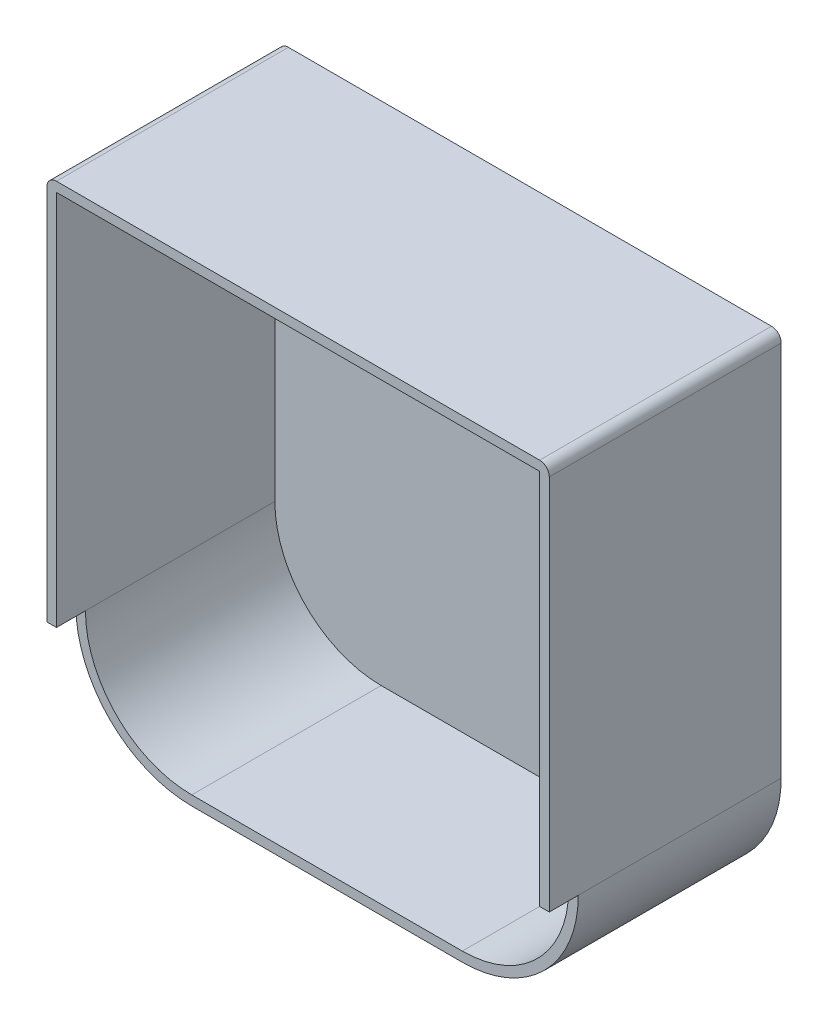
ISO-10303-21;
HEADER;
FILE_DESCRIPTION(('STEP AP214'),'2;1');
FILE_NAME('part.step','',(''),(''),'','','');
FILE_SCHEMA(('AUTOMOTIVE_DESIGN { 1 0 10303 214 1 1 1 1 }'));
ENDSEC;
DATA;
#1=APPLICATION_CONTEXT('core data for automotive mechanical design processes');
#2=APPLICATION_PROTOCOL_DEFINITION('international standard','automotive_design',2000,#1);
#3=PRODUCT_CONTEXT('',#1,'mechanical');
#4=PRODUCT('Part','Part','',(#3));
#5=PRODUCT_RELATED_PRODUCT_CATEGORY('part','',(#4));
#6=PRODUCT_DEFINITION_FORMATION('','',#4);
#7=PRODUCT_DEFINITION_CONTEXT('part definition',#1,'design');
#8=PRODUCT_DEFINITION('design','',#6,#7);
#9=PRODUCT_DEFINITION_SHAPE('','',#8);
#10=(LENGTH_UNIT() NAMED_UNIT(*) SI_UNIT(.MILLI.,.METRE.));
#11=(NAMED_UNIT(*) PLANE_ANGLE_UNIT() SI_UNIT($,.RADIAN.));
#12=(NAMED_UNIT(*) SI_UNIT($,.STERADIAN.) SOLID_ANGLE_UNIT());
#13=UNCERTAINTY_MEASURE_WITH_UNIT(LENGTH_MEASURE(1.E-05),#10,'distance_accuracy_value','');
#14=(GEOMETRIC_REPRESENTATION_CONTEXT(3) GLOBAL_UNCERTAINTY_ASSIGNED_CONTEXT((#13)) GLOBAL_UNIT_ASSIGNED_CONTEXT((#10,
#11,#12)) REPRESENTATION_CONTEXT('',''));
#15=CARTESIAN_POINT('',(0.,0.,0.));
#16=DIRECTION('',(0.,0.,1.));
#17=DIRECTION('',(1.,0.,0.));
#18=AXIS2_PLACEMENT_3D('',#15,#16,#17);
#19=CARTESIAN_POINT('',(0.,0.,120.));
#20=DIRECTION('',(1.,0.,0.));
#21=DIRECTION('',(0.,0.,-1.));
#22=AXIS2_PLACEMENT_3D('',#19,#20,#21);
#23=PLANE('',#22);
#24=DIRECTION('',(0.,-1.,0.));
#25=VECTOR('',#24,1.);
#26=CARTESIAN_POINT('',(0.,0.,120.));
#27=LINE('',#26,#25);
#28=CARTESIAN_POINT('',(0.,255.,120.));
#29=VERTEX_POINT('',#28);
#30=CARTESIAN_POINT('',(0.,60.,120.));
#31=VERTEX_POINT('',#30);
#32=EDGE_CURVE('E523',#29,#31,#27,.T.);
#33=ORIENTED_EDGE('',*,*,#32,.F.);
#34=DIRECTION('',(0.,0.,-1.));
#35=VECTOR('',#34,1.);
#36=CARTESIAN_POINT('',(0.,255.,120.));
#37=LINE('',#36,#35);
#38=CARTESIAN_POINT('',(0.,255.,0.));
#39=VERTEX_POINT('',#38);
#40=EDGE_CURVE('E572',#29,#39,#37,.T.);
#41=ORIENTED_EDGE('',*,*,#40,.T.);
#42=DIRECTION('',(0.,-1.,0.));
#43=VECTOR('',#42,1.);
#44=CARTESIAN_POINT('',(0.,0.,0.));
#45=LINE('',#44,#43);
#46=CARTESIAN_POINT('',(0.,60.,0.));
#47=VERTEX_POINT('',#46);
#48=EDGE_CURVE('E503',#39,#47,#45,.T.);
#49=ORIENTED_EDGE('',*,*,#48,.T.);
#50=DIRECTION('',(0.,0.,-1.));
#51=VECTOR('',#50,1.);
#52=CARTESIAN_POINT('',(0.,60.,120.));
#53=LINE('',#52,#51);
#54=CARTESIAN_POINT('',(0.,60.,105.));
#55=VERTEX_POINT('',#54);
#56=EDGE_CURVE('E568',#47,#55,#53,.F.);
#57=ORIENTED_EDGE('',*,*,#56,.T.);
#58=DIRECTION('',(0.,0.,1.));
#59=VECTOR('',#58,1.);
#60=CARTESIAN_POINT('',(0.,60.,105.));
#61=LINE('',#60,#59);
#62=EDGE_CURVE('E438',#55,#31,#61,.T.);
#63=ORIENTED_EDGE('',*,*,#62,.T.);
#64=EDGE_LOOP('',(#33,#41,#49,#57,#63));
#65=FACE_BOUND('',#64,.T.);
#66=ADVANCED_FACE('F41',(#65),#23,.F.);
#67=CARTESIAN_POINT('',(0.,0.,120.));
#68=DIRECTION('',(0.,1.,0.));
#69=DIRECTION('',(0.,0.,1.));
#70=AXIS2_PLACEMENT_3D('',#67,#68,#69);
#71=PLANE('',#70);
#72=DIRECTION('',(0.,0.,-1.));
#73=VECTOR('',#72,1.);
#74=CARTESIAN_POINT('',(200.,0.,120.));
#75=LINE('',#74,#73);
#76=CARTESIAN_POINT('',(200.,0.,0.));
#77=VERTEX_POINT('',#76);
#78=CARTESIAN_POINT('',(200.,0.,105.));
#79=VERTEX_POINT('',#78);
#80=EDGE_CURVE('E564',#77,#79,#75,.F.);
#81=ORIENTED_EDGE('',*,*,#80,.T.);
#82=DIRECTION('',(1.,0.,0.));
#83=VECTOR('',#82,1.);
#84=CARTESIAN_POINT('',(260.,0.,105.));
#85=LINE('',#84,#83);
#86=CARTESIAN_POINT('',(60.,0.,105.));
#87=VERTEX_POINT('',#86);
#88=EDGE_CURVE('E434',#87,#79,#85,.T.);
#89=ORIENTED_EDGE('',*,*,#88,.F.);
#90=DIRECTION('',(0.,0.,-1.));
#91=VECTOR('',#90,1.);
#92=CARTESIAN_POINT('',(60.,0.,120.));
#93=LINE('',#92,#91);
#94=CARTESIAN_POINT('',(60.,0.,0.));
#95=VERTEX_POINT('',#94);
#96=EDGE_CURVE('E561',#87,#95,#93,.T.);
#97=ORIENTED_EDGE('',*,*,#96,.T.);
#98=DIRECTION('',(1.,0.,0.));
#99=VECTOR('',#98,1.);
#100=CARTESIAN_POINT('',(0.,0.,0.));
#101=LINE('',#100,#99);
#102=EDGE_CURVE('E539',#95,#77,#101,.T.);
#103=ORIENTED_EDGE('',*,*,#102,.T.);
#104=EDGE_LOOP('',(#81,#89,#97,#103));
#105=FACE_BOUND('',#104,.T.);
#106=ADVANCED_FACE('F669',(#105),#71,.F.);
#107=CARTESIAN_POINT('',(260.,0.,120.));
#108=DIRECTION('',(-1.,0.,0.));
#109=DIRECTION('',(0.,0.,1.));
#110=AXIS2_PLACEMENT_3D('',#107,#108,#109);
#111=PLANE('',#110);
#112=DIRECTION('',(0.,1.,0.));
#113=VECTOR('',#112,1.);
#114=CARTESIAN_POINT('',(260.,0.,0.));
#115=LINE('',#114,#113);
#116=CARTESIAN_POINT('',(260.,60.,0.));
#117=VERTEX_POINT('',#116);
#118=CARTESIAN_POINT('',(260.,255.,0.));
#119=VERTEX_POINT('',#118);
#120=EDGE_CURVE('E543',#117,#119,#115,.T.);
#121=ORIENTED_EDGE('',*,*,#120,.T.);
#122=DIRECTION('',(0.,0.,-1.));
#123=VECTOR('',#122,1.);
#124=CARTESIAN_POINT('',(260.,255.,120.));
#125=LINE('',#124,#123);
#126=CARTESIAN_POINT('',(260.,255.,120.));
#127=VERTEX_POINT('',#126);
#128=EDGE_CURVE('E50',#119,#127,#125,.F.);
#129=ORIENTED_EDGE('',*,*,#128,.T.);
#130=DIRECTION('',(0.,1.,0.));
#131=VECTOR('',#130,1.);
#132=CARTESIAN_POINT('',(260.,0.,120.));
#133=LINE('',#132,#131);
#134=CARTESIAN_POINT('',(260.,60.,120.));
#135=VERTEX_POINT('',#134);
#136=EDGE_CURVE('E527',#135,#127,#133,.T.);
#137=ORIENTED_EDGE('',*,*,#136,.F.);
#138=DIRECTION('',(0.,0.,-1.));
#139=VECTOR('',#138,1.);
#140=CARTESIAN_POINT('',(260.,60.,120.));
#141=LINE('',#140,#139);
#142=CARTESIAN_POINT('',(260.,60.,105.));
#143=VERTEX_POINT('',#142);
#144=EDGE_CURVE('E550',#135,#143,#141,.T.);
#145=ORIENTED_EDGE('',*,*,#144,.T.);
#146=EDGE_CURVE('E536',#143,#117,#141,.T.);
#147=ORIENTED_EDGE('',*,*,#146,.T.);
#148=EDGE_LOOP('',(#121,#129,#137,#145,#147));
#149=FACE_BOUND('',#148,.T.);
#150=ADVANCED_FACE('F598',(#149),#111,.F.);
#151=CARTESIAN_POINT('',(0.,260.,120.));
#152=DIRECTION('',(0.,-1.,0.));
#153=DIRECTION('',(0.,0.,-1.));
#154=AXIS2_PLACEMENT_3D('',#151,#152,#153);
#155=PLANE('',#154);
#156=DIRECTION('',(-1.,0.,0.));
#157=VECTOR('',#156,1.);
#158=CARTESIAN_POINT('',(0.,260.,0.));
#159=LINE('',#158,#157);
#160=CARTESIAN_POINT('',(255.,260.,0.));
#161=VERTEX_POINT('',#160);
#162=CARTESIAN_POINT('',(5.,260.,0.));
#163=VERTEX_POINT('',#162);
#164=EDGE_CURVE('E528',#161,#163,#159,.T.);
#165=ORIENTED_EDGE('',*,*,#164,.T.);
#166=DIRECTION('',(0.,0.,-1.));
#167=VECTOR('',#166,1.);
#168=CARTESIAN_POINT('',(5.,260.,120.));
#169=LINE('',#168,#167);
#170=CARTESIAN_POINT('',(5.,260.,120.));
#171=VERTEX_POINT('',#170);
#172=EDGE_CURVE('E586',#163,#171,#169,.F.);
#173=ORIENTED_EDGE('',*,*,#172,.T.);
#174=DIRECTION('',(-1.,0.,0.));
#175=VECTOR('',#174,1.);
#176=CARTESIAN_POINT('',(0.,260.,120.));
#177=LINE('',#176,#175);
#178=CARTESIAN_POINT('',(255.,260.,120.));
#179=VERTEX_POINT('',#178);
#180=EDGE_CURVE('E532',#179,#171,#177,.T.);
#181=ORIENTED_EDGE('',*,*,#180,.F.);
#182=DIRECTION('',(0.,0.,-1.));
#183=VECTOR('',#182,1.);
#184=CARTESIAN_POINT('',(255.,260.,120.));
#185=LINE('',#184,#183);
#186=EDGE_CURVE('E582',#179,#161,#185,.T.);
#187=ORIENTED_EDGE('',*,*,#186,.T.);
#188=EDGE_LOOP('',(#165,#173,#181,#187));
#189=FACE_BOUND('',#188,.T.);
#190=ADVANCED_FACE('F610',(#189),#155,.F.);
#191=CARTESIAN_POINT('',(0.,0.,120.));
#192=DIRECTION('',(0.,0.,-1.));
#193=DIRECTION('',(-1.,0.,0.));
#194=AXIS2_PLACEMENT_3D('',#191,#192,#193);
#195=PLANE('',#194);
#196=ORIENTED_EDGE('',*,*,#32,.T.);
#197=DIRECTION('',(-1.,0.,0.));
#198=VECTOR('',#197,1.);
#199=CARTESIAN_POINT('',(260.,60.,120.));
#200=LINE('',#199,#198);
#201=CARTESIAN_POINT('',(5.00000000000002,60.,120.));
#202=VERTEX_POINT('',#201);
#203=EDGE_CURVE('E396',#202,#31,#200,.T.);
#204=ORIENTED_EDGE('',*,*,#203,.F.);
#205=DIRECTION('',(0.,-1.,0.));
#206=VECTOR('',#205,1.);
#207=CARTESIAN_POINT('',(5.,255.,120.));
#208=LINE('',#207,#206);
#209=CARTESIAN_POINT('',(5.,255.,120.));
#210=VERTEX_POINT('',#209);
#211=EDGE_CURVE('E463',#210,#202,#208,.T.);
#212=ORIENTED_EDGE('',*,*,#211,.F.);
#213=DIRECTION('',(-1.,0.,0.));
#214=VECTOR('',#213,1.);
#215=CARTESIAN_POINT('',(5.,255.,120.));
#216=LINE('',#215,#214);
#217=CARTESIAN_POINT('',(255.,255.,120.));
#218=VERTEX_POINT('',#217);
#219=EDGE_CURVE('E469',#218,#210,#216,.T.);
#220=ORIENTED_EDGE('',*,*,#219,.F.);
#221=DIRECTION('',(0.,1.,0.));
#222=VECTOR('',#221,1.);
#223=CARTESIAN_POINT('',(255.,255.,120.));
#224=LINE('',#223,#222);
#225=CARTESIAN_POINT('',(255.,60.,120.));
#226=VERTEX_POINT('',#225);
#227=EDGE_CURVE('E493',#226,#218,#224,.T.);
#228=ORIENTED_EDGE('',*,*,#227,.F.);
#229=EDGE_CURVE('E439',#135,#226,#200,.T.);
#230=ORIENTED_EDGE('',*,*,#229,.F.);
#231=ORIENTED_EDGE('',*,*,#136,.T.);
#232=CARTESIAN_POINT('',(255.,255.,120.));
#233=DIRECTION('',(0.,0.,-1.));
#234=DIRECTION('',(-1.,0.,0.));
#235=AXIS2_PLACEMENT_3D('',#232,#233,#234);
#236=CIRCLE('',#235,5.);
#237=EDGE_CURVE('E589',#127,#179,#236,.F.);
#238=ORIENTED_EDGE('',*,*,#237,.T.);
#239=ORIENTED_EDGE('',*,*,#180,.T.);
#240=CARTESIAN_POINT('',(5.,255.,120.));
#241=DIRECTION('',(0.,0.,-1.));
#242=DIRECTION('',(-1.,0.,0.));
#243=AXIS2_PLACEMENT_3D('',#240,#241,#242);
#244=CIRCLE('',#243,5.);
#245=EDGE_CURVE('E592',#171,#29,#244,.F.);
#246=ORIENTED_EDGE('',*,*,#245,.T.);
#247=EDGE_LOOP('',(#196,#204,#212,#220,#228,#230,#231,#238,#239,#246));
#248=FACE_BOUND('',#247,.T.);
#249=ADVANCED_FACE('F604',(#248),#195,.F.);
#250=CARTESIAN_POINT('',(0.,0.,0.));
#251=DIRECTION('',(0.,0.,-1.));
#252=DIRECTION('',(-1.,0.,0.));
#253=AXIS2_PLACEMENT_3D('',#250,#251,#252);
#254=PLANE('',#253);
#255=DIRECTION('',(-1.,0.,0.));
#256=VECTOR('',#255,1.);
#257=CARTESIAN_POINT('',(215.,120.,0.));
#258=LINE('',#257,#256);
#259=CARTESIAN_POINT('',(240.,120.,0.));
#260=VERTEX_POINT('',#259);
#261=CARTESIAN_POINT('',(215.,120.,0.));
#262=VERTEX_POINT('',#261);
#263=EDGE_CURVE('E297',#260,#262,#258,.T.);
#264=ORIENTED_EDGE('',*,*,#263,.F.);
#265=DIRECTION('',(0.,-1.,0.));
#266=VECTOR('',#265,1.);
#267=CARTESIAN_POINT('',(240.,120.,0.));
#268=LINE('',#267,#266);
#269=CARTESIAN_POINT('',(240.,230.,0.));
#270=VERTEX_POINT('',#269);
#271=EDGE_CURVE('E303',#270,#260,#268,.T.);
#272=ORIENTED_EDGE('',*,*,#271,.F.);
#273=CARTESIAN_POINT('',(230.,230.,0.));
#274=DIRECTION('',(0.,0.,-1.));
#275=DIRECTION('',(1.,0.,0.));
#276=AXIS2_PLACEMENT_3D('',#273,#274,#275);
#277=CIRCLE('',#276,10.);
#278=CARTESIAN_POINT('',(230.,240.,0.));
#279=VERTEX_POINT('',#278);
#280=EDGE_CURVE('E386',#279,#270,#277,.T.);
#281=ORIENTED_EDGE('',*,*,#280,.F.);
#282=DIRECTION('',(1.,0.,0.));
#283=VECTOR('',#282,1.);
#284=CARTESIAN_POINT('',(230.,240.,0.));
#285=LINE('',#284,#283);
#286=CARTESIAN_POINT('',(30.0000000000001,240.,0.));
#287=VERTEX_POINT('',#286);
#288=EDGE_CURVE('E382',#287,#279,#285,.T.);
#289=ORIENTED_EDGE('',*,*,#288,.F.);
#290=CARTESIAN_POINT('',(30.,230.,0.));
#291=DIRECTION('',(0.,0.,-1.));
#292=DIRECTION('',(1.,0.,0.));
#293=AXIS2_PLACEMENT_3D('',#290,#291,#292);
#294=CIRCLE('',#293,10.);
#295=CARTESIAN_POINT('',(20.,230.,0.));
#296=VERTEX_POINT('',#295);
#297=EDGE_CURVE('E378',#296,#287,#294,.T.);
#298=ORIENTED_EDGE('',*,*,#297,.F.);
#299=DIRECTION('',(0.,1.,0.));
#300=VECTOR('',#299,1.);
#301=CARTESIAN_POINT('',(20.,230.,0.));
#302=LINE('',#301,#300);
#303=CARTESIAN_POINT('',(20.,120.,0.));
#304=VERTEX_POINT('',#303);
#305=EDGE_CURVE('E374',#304,#296,#302,.T.);
#306=ORIENTED_EDGE('',*,*,#305,.F.);
#307=DIRECTION('',(-1.,0.,0.));
#308=VECTOR('',#307,1.);
#309=CARTESIAN_POINT('',(20.,120.,0.));
#310=LINE('',#309,#308);
#311=CARTESIAN_POINT('',(45.,120.,0.));
#312=VERTEX_POINT('',#311);
#313=EDGE_CURVE('E370',#312,#304,#310,.T.);
#314=ORIENTED_EDGE('',*,*,#313,.F.);
#315=DIRECTION('',(0.,-1.,0.));
#316=VECTOR('',#315,1.);
#317=CARTESIAN_POINT('',(45.,120.,0.));
#318=LINE('',#317,#316);
#319=CARTESIAN_POINT('',(45.,205.,0.));
#320=VERTEX_POINT('',#319);
#321=EDGE_CURVE('E366',#320,#312,#318,.T.);
#322=ORIENTED_EDGE('',*,*,#321,.F.);
#323=CARTESIAN_POINT('',(55.,205.,0.));
#324=DIRECTION('',(0.,0.,1.));
#325=DIRECTION('',(-1.,0.,0.));
#326=AXIS2_PLACEMENT_3D('',#323,#324,#325);
#327=CIRCLE('',#326,10.);
#328=CARTESIAN_POINT('',(55.,215.,0.));
#329=VERTEX_POINT('',#328);
#330=EDGE_CURVE('E362',#329,#320,#327,.T.);
#331=ORIENTED_EDGE('',*,*,#330,.F.);
#332=DIRECTION('',(-1.,0.,0.));
#333=VECTOR('',#332,1.);
#334=CARTESIAN_POINT('',(55.,215.,0.));
#335=LINE('',#334,#333);
#336=CARTESIAN_POINT('',(205.,215.,0.));
#337=VERTEX_POINT('',#336);
#338=EDGE_CURVE('E358',#337,#329,#335,.T.);
#339=ORIENTED_EDGE('',*,*,#338,.F.);
#340=CARTESIAN_POINT('',(205.,205.,0.));
#341=DIRECTION('',(0.,0.,1.));
#342=DIRECTION('',(-1.,0.,0.));
#343=AXIS2_PLACEMENT_3D('',#340,#341,#342);
#344=CIRCLE('',#343,10.);
#345=CARTESIAN_POINT('',(215.,205.,0.));
#346=VERTEX_POINT('',#345);
#347=EDGE_CURVE('E354',#346,#337,#344,.T.);
#348=ORIENTED_EDGE('',*,*,#347,.F.);
#349=DIRECTION('',(0.,1.,0.));
#350=VECTOR('',#349,1.);
#351=CARTESIAN_POINT('',(215.,205.,0.));
#352=LINE('',#351,#350);
#353=EDGE_CURVE('E350',#262,#346,#352,.T.);
#354=ORIENTED_EDGE('',*,*,#353,.F.);
#355=EDGE_LOOP('',(#264,#272,#281,#289,#298,#306,#314,#322,#331,#339,#348,#354));
#356=FACE_BOUND('',#355,.T.);
#357=ORIENTED_EDGE('',*,*,#48,.F.);
#358=CARTESIAN_POINT('',(5.,255.,0.));
#359=DIRECTION('',(0.,0.,-1.));
#360=DIRECTION('',(-1.,0.,0.));
#361=AXIS2_PLACEMENT_3D('',#358,#359,#360);
#362=CIRCLE('',#361,5.);
#363=EDGE_CURVE('E579',#39,#163,#362,.T.);
#364=ORIENTED_EDGE('',*,*,#363,.T.);
#365=ORIENTED_EDGE('',*,*,#164,.F.);
#366=CARTESIAN_POINT('',(255.,255.,0.));
#367=DIRECTION('',(0.,0.,-1.));
#368=DIRECTION('',(-1.,0.,0.));
#369=AXIS2_PLACEMENT_3D('',#366,#367,#368);
#370=CIRCLE('',#369,5.);
#371=EDGE_CURVE('E576',#161,#119,#370,.T.);
#372=ORIENTED_EDGE('',*,*,#371,.T.);
#373=ORIENTED_EDGE('',*,*,#120,.F.);
#374=CARTESIAN_POINT('',(200.,60.,0.));
#375=DIRECTION('',(0.,0.,-1.));
#376=DIRECTION('',(-1.,0.,0.));
#377=AXIS2_PLACEMENT_3D('',#374,#375,#376);
#378=CIRCLE('',#377,60.);
#379=EDGE_CURVE('E558',#117,#77,#378,.T.);
#380=ORIENTED_EDGE('',*,*,#379,.T.);
#381=ORIENTED_EDGE('',*,*,#102,.F.);
#382=CARTESIAN_POINT('',(60.,60.,0.));
#383=DIRECTION('',(0.,0.,-1.));
#384=DIRECTION('',(-1.,0.,0.));
#385=AXIS2_PLACEMENT_3D('',#382,#383,#384);
#386=CIRCLE('',#385,60.);
#387=EDGE_CURVE('E554',#95,#47,#386,.T.);
#388=ORIENTED_EDGE('',*,*,#387,.T.);
#389=EDGE_LOOP('',(#357,#364,#365,#372,#373,#380,#381,#388));
#390=FACE_BOUND('',#389,.T.);
#391=ADVANCED_FACE('F614',(#356,#390),#254,.T.);
#392=CARTESIAN_POINT('',(200.,60.,120.));
#393=DIRECTION('',(0.,0.,-1.));
#394=DIRECTION('',(-1.,0.,0.));
#395=AXIS2_PLACEMENT_3D('',#392,#393,#394);
#396=CYLINDRICAL_SURFACE('',#395,60.);
#397=CARTESIAN_POINT('',(200.,60.,105.));
#398=DIRECTION('',(0.,0.,-1.));
#399=DIRECTION('',(-1.,0.,0.));
#400=AXIS2_PLACEMENT_3D('',#397,#398,#399);
#401=CIRCLE('',#400,60.);
#402=EDGE_CURVE('E456',#79,#143,#401,.F.);
#403=ORIENTED_EDGE('',*,*,#402,.F.);
#404=ORIENTED_EDGE('',*,*,#80,.F.);
#405=ORIENTED_EDGE('',*,*,#379,.F.);
#406=ORIENTED_EDGE('',*,*,#146,.F.);
#407=EDGE_LOOP('',(#403,#404,#405,#406));
#408=FACE_BOUND('',#407,.T.);
#409=ADVANCED_FACE('F678',(#408),#396,.T.);
#410=CARTESIAN_POINT('',(60.,60.,120.));
#411=DIRECTION('',(0.,0.,-1.));
#412=DIRECTION('',(-1.,0.,0.));
#413=AXIS2_PLACEMENT_3D('',#410,#411,#412);
#414=CYLINDRICAL_SURFACE('',#413,60.);
#415=CARTESIAN_POINT('',(60.,60.,105.));
#416=DIRECTION('',(0.,0.,-1.));
#417=DIRECTION('',(-1.,0.,0.));
#418=AXIS2_PLACEMENT_3D('',#415,#416,#417);
#419=CIRCLE('',#418,60.);
#420=EDGE_CURVE('E453',#55,#87,#419,.F.);
#421=ORIENTED_EDGE('',*,*,#420,.F.);
#422=ORIENTED_EDGE('',*,*,#56,.F.);
#423=ORIENTED_EDGE('',*,*,#387,.F.);
#424=ORIENTED_EDGE('',*,*,#96,.F.);
#425=EDGE_LOOP('',(#421,#422,#423,#424));
#426=FACE_BOUND('',#425,.T.);
#427=ADVANCED_FACE('F681',(#426),#414,.T.);
#428=CARTESIAN_POINT('',(5.,255.,120.));
#429=DIRECTION('',(0.,0.,-1.));
#430=DIRECTION('',(-1.,0.,0.));
#431=AXIS2_PLACEMENT_3D('',#428,#429,#430);
#432=CYLINDRICAL_SURFACE('',#431,5.);
#433=ORIENTED_EDGE('',*,*,#245,.F.);
#434=ORIENTED_EDGE('',*,*,#172,.F.);
#435=ORIENTED_EDGE('',*,*,#363,.F.);
#436=ORIENTED_EDGE('',*,*,#40,.F.);
#437=EDGE_LOOP('',(#433,#434,#435,#436));
#438=FACE_BOUND('',#437,.T.);
#439=ADVANCED_FACE('F618',(#438),#432,.T.);
#440=CARTESIAN_POINT('',(255.,255.,120.));
#441=DIRECTION('',(0.,0.,-1.));
#442=DIRECTION('',(-1.,0.,0.));
#443=AXIS2_PLACEMENT_3D('',#440,#441,#442);
#444=CYLINDRICAL_SURFACE('',#443,5.);
#445=ORIENTED_EDGE('',*,*,#237,.F.);
#446=ORIENTED_EDGE('',*,*,#128,.F.);
#447=ORIENTED_EDGE('',*,*,#371,.F.);
#448=ORIENTED_EDGE('',*,*,#186,.F.);
#449=EDGE_LOOP('',(#445,#446,#447,#448));
#450=FACE_BOUND('',#449,.T.);
#451=ADVANCED_FACE('F43',(#450),#444,.T.);
#452=CARTESIAN_POINT('',(5.,255.,6.99999999999999));
#453=DIRECTION('',(-1.,0.,0.));
#454=DIRECTION('',(0.,-1.,0.));
#455=AXIS2_PLACEMENT_3D('',#452,#453,#454);
#456=PLANE('',#455);
#457=ORIENTED_EDGE('',*,*,#211,.T.);
#458=DIRECTION('',(0.,0.,1.));
#459=VECTOR('',#458,1.);
#460=CARTESIAN_POINT('',(5.00000000000002,60.,6.99999999999999));
#461=LINE('',#460,#459);
#462=CARTESIAN_POINT('',(5.00000000000002,60.,105.));
#463=VERTEX_POINT('',#462);
#464=EDGE_CURVE('E489',#463,#202,#461,.T.);
#465=ORIENTED_EDGE('',*,*,#464,.F.);
#466=CARTESIAN_POINT('',(5.00000000000002,60.,6.99999999999999));
#467=VERTEX_POINT('',#466);
#468=EDGE_CURVE('E519',#467,#463,#461,.T.);
#469=ORIENTED_EDGE('',*,*,#468,.F.);
#470=DIRECTION('',(0.,-1.,0.));
#471=VECTOR('',#470,1.);
#472=CARTESIAN_POINT('',(5.,255.,6.99999999999999));
#473=LINE('',#472,#471);
#474=CARTESIAN_POINT('',(5.,255.,6.99999999999999));
#475=VERTEX_POINT('',#474);
#476=EDGE_CURVE('E464',#475,#467,#473,.T.);
#477=ORIENTED_EDGE('',*,*,#476,.F.);
#478=DIRECTION('',(0.,0.,1.));
#479=VECTOR('',#478,1.);
#480=CARTESIAN_POINT('',(5.,255.,6.99999999999999));
#481=LINE('',#480,#479);
#482=EDGE_CURVE('E500',#475,#210,#481,.T.);
#483=ORIENTED_EDGE('',*,*,#482,.T.);
#484=EDGE_LOOP('',(#457,#465,#469,#477,#483));
#485=FACE_BOUND('',#484,.T.);
#486=ADVANCED_FACE('F629',(#485),#456,.F.);
#487=CARTESIAN_POINT('',(5.,255.,6.99999999999999));
#488=DIRECTION('',(0.,1.,0.));
#489=DIRECTION('',(0.,0.,1.));
#490=AXIS2_PLACEMENT_3D('',#487,#488,#489);
#491=PLANE('',#490);
#492=ORIENTED_EDGE('',*,*,#219,.T.);
#493=ORIENTED_EDGE('',*,*,#482,.F.);
#494=DIRECTION('',(-1.,0.,0.));
#495=VECTOR('',#494,1.);
#496=CARTESIAN_POINT('',(5.,255.,6.99999999999999));
#497=LINE('',#496,#495);
#498=CARTESIAN_POINT('',(255.,255.,6.99999999999999));
#499=VERTEX_POINT('',#498);
#500=EDGE_CURVE('E485',#499,#475,#497,.T.);
#501=ORIENTED_EDGE('',*,*,#500,.F.);
#502=DIRECTION('',(0.,0.,1.));
#503=VECTOR('',#502,1.);
#504=CARTESIAN_POINT('',(255.,255.,6.99999999999999));
#505=LINE('',#504,#503);
#506=EDGE_CURVE('E504',#499,#218,#505,.T.);
#507=ORIENTED_EDGE('',*,*,#506,.T.);
#508=EDGE_LOOP('',(#492,#493,#501,#507));
#509=FACE_BOUND('',#508,.T.);
#510=ADVANCED_FACE('F633',(#509),#491,.F.);
#511=CARTESIAN_POINT('',(255.,255.,6.99999999999999));
#512=DIRECTION('',(1.,0.,0.));
#513=DIRECTION('',(0.,0.,-1.));
#514=AXIS2_PLACEMENT_3D('',#511,#512,#513);
#515=PLANE('',#514);
#516=ORIENTED_EDGE('',*,*,#227,.T.);
#517=ORIENTED_EDGE('',*,*,#506,.F.);
#518=DIRECTION('',(0.,1.,0.));
#519=VECTOR('',#518,1.);
#520=CARTESIAN_POINT('',(255.,255.,6.99999999999999));
#521=LINE('',#520,#519);
#522=CARTESIAN_POINT('',(255.,60.,6.99999999999999));
#523=VERTEX_POINT('',#522);
#524=EDGE_CURVE('E481',#523,#499,#521,.T.);
#525=ORIENTED_EDGE('',*,*,#524,.F.);
#526=DIRECTION('',(0.,0.,1.));
#527=VECTOR('',#526,1.);
#528=CARTESIAN_POINT('',(255.,60.,6.99999999999999));
#529=LINE('',#528,#527);
#530=CARTESIAN_POINT('',(255.,60.,105.));
#531=VERTEX_POINT('',#530);
#532=EDGE_CURVE('E507',#523,#531,#529,.T.);
#533=ORIENTED_EDGE('',*,*,#532,.T.);
#534=DIRECTION('',(0.,0.,1.));
#535=VECTOR('',#534,1.);
#536=CARTESIAN_POINT('',(255.,60.,6.99999999999999));
#537=LINE('',#536,#535);
#538=EDGE_CURVE('E459',#531,#226,#537,.T.);
#539=ORIENTED_EDGE('',*,*,#538,.T.);
#540=EDGE_LOOP('',(#516,#517,#525,#533,#539));
#541=FACE_BOUND('',#540,.T.);
#542=ADVANCED_FACE('F635',(#541),#515,.F.);
#543=CARTESIAN_POINT('',(200.,60.,6.99999999999999));
#544=DIRECTION('',(0.,0.,1.));
#545=DIRECTION('',(1.,0.,0.));
#546=AXIS2_PLACEMENT_3D('',#543,#544,#545);
#547=CYLINDRICAL_SURFACE('',#546,55.);
#548=DIRECTION('',(0.,0.,1.));
#549=VECTOR('',#548,1.);
#550=CARTESIAN_POINT('',(200.,5.00000000000002,6.99999999999999));
#551=LINE('',#550,#549);
#552=CARTESIAN_POINT('',(200.,5.00000000000002,6.99999999999999));
#553=VERTEX_POINT('',#552);
#554=CARTESIAN_POINT('',(200.,5.,105.));
#555=VERTEX_POINT('',#554);
#556=EDGE_CURVE('E511',#553,#555,#551,.T.);
#557=ORIENTED_EDGE('',*,*,#556,.T.);
#558=CARTESIAN_POINT('',(200.,60.,105.));
#559=DIRECTION('',(0.,0.,-1.));
#560=DIRECTION('',(-1.,0.,0.));
#561=AXIS2_PLACEMENT_3D('',#558,#559,#560);
#562=CIRCLE('',#561,55.);
#563=EDGE_CURVE('E449',#555,#531,#562,.F.);
#564=ORIENTED_EDGE('',*,*,#563,.T.);
#565=ORIENTED_EDGE('',*,*,#532,.F.);
#566=CARTESIAN_POINT('',(200.,60.,6.99999999999999));
#567=DIRECTION('',(0.,0.,1.));
#568=DIRECTION('',(1.,0.,0.));
#569=AXIS2_PLACEMENT_3D('',#566,#567,#568);
#570=CIRCLE('',#569,55.);
#571=EDGE_CURVE('E477',#553,#523,#570,.T.);
#572=ORIENTED_EDGE('',*,*,#571,.F.);
#573=EDGE_LOOP('',(#557,#564,#565,#572));
#574=FACE_BOUND('',#573,.T.);
#575=ADVANCED_FACE('F645',(#574),#547,.F.);
#576=CARTESIAN_POINT('',(60.,5.,6.99999999999999));
#577=DIRECTION('',(0.,-1.,0.));
#578=DIRECTION('',(1.,0.,0.));
#579=AXIS2_PLACEMENT_3D('',#576,#577,#578);
#580=PLANE('',#579);
#581=DIRECTION('',(0.,0.,1.));
#582=VECTOR('',#581,1.);
#583=CARTESIAN_POINT('',(60.,5.,6.99999999999999));
#584=LINE('',#583,#582);
#585=CARTESIAN_POINT('',(60.,5.,6.99999999999999));
#586=VERTEX_POINT('',#585);
#587=CARTESIAN_POINT('',(60.,5.,105.));
#588=VERTEX_POINT('',#587);
#589=EDGE_CURVE('E515',#586,#588,#584,.T.);
#590=ORIENTED_EDGE('',*,*,#589,.T.);
#591=DIRECTION('',(1.,0.,0.));
#592=VECTOR('',#591,1.);
#593=CARTESIAN_POINT('',(60.,5.,105.));
#594=LINE('',#593,#592);
#595=EDGE_CURVE('E445',#588,#555,#594,.T.);
#596=ORIENTED_EDGE('',*,*,#595,.T.);
#597=ORIENTED_EDGE('',*,*,#556,.F.);
#598=DIRECTION('',(1.,0.,0.));
#599=VECTOR('',#598,1.);
#600=CARTESIAN_POINT('',(60.,5.,6.99999999999999));
#601=LINE('',#600,#599);
#602=EDGE_CURVE('E473',#586,#553,#601,.T.);
#603=ORIENTED_EDGE('',*,*,#602,.F.);
#604=EDGE_LOOP('',(#590,#596,#597,#603));
#605=FACE_BOUND('',#604,.T.);
#606=ADVANCED_FACE('F649',(#605),#580,.F.);
#607=CARTESIAN_POINT('',(60.,60.,6.99999999999999));
#608=DIRECTION('',(0.,0.,1.));
#609=DIRECTION('',(1.,0.,0.));
#610=AXIS2_PLACEMENT_3D('',#607,#608,#609);
#611=CYLINDRICAL_SURFACE('',#610,55.);
#612=ORIENTED_EDGE('',*,*,#468,.T.);
#613=CARTESIAN_POINT('',(60.,60.,105.));
#614=DIRECTION('',(0.,0.,-1.));
#615=DIRECTION('',(-1.,0.,0.));
#616=AXIS2_PLACEMENT_3D('',#613,#614,#615);
#617=CIRCLE('',#616,55.);
#618=EDGE_CURVE('E11',#463,#588,#617,.F.);
#619=ORIENTED_EDGE('',*,*,#618,.T.);
#620=ORIENTED_EDGE('',*,*,#589,.F.);
#621=CARTESIAN_POINT('',(60.,60.,6.99999999999999));
#622=DIRECTION('',(0.,0.,1.));
#623=DIRECTION('',(1.,0.,0.));
#624=AXIS2_PLACEMENT_3D('',#621,#622,#623);
#625=CIRCLE('',#624,55.);
#626=EDGE_CURVE('E468',#467,#586,#625,.T.);
#627=ORIENTED_EDGE('',*,*,#626,.F.);
#628=EDGE_LOOP('',(#612,#619,#620,#627));
#629=FACE_BOUND('',#628,.T.);
#630=ADVANCED_FACE('F652',(#629),#611,.F.);
#631=CARTESIAN_POINT('',(60.,60.,6.99999999999999));
#632=DIRECTION('',(0.,0.,1.));
#633=DIRECTION('',(1.,0.,0.));
#634=AXIS2_PLACEMENT_3D('',#631,#632,#633);
#635=PLANE('',#634);
#636=CARTESIAN_POINT('',(39.5,227.5,6.99999999999999));
#637=DIRECTION('',(0.,0.,1.));
#638=DIRECTION('',(1.,0.,0.));
#639=AXIS2_PLACEMENT_3D('',#636,#637,#638);
#640=CIRCLE('',#639,11.);
#641=CARTESIAN_POINT('',(39.5,238.5,6.99999999999999));
#642=VERTEX_POINT('',#641);
#643=CARTESIAN_POINT('',(39.5,216.5,6.99999999999999));
#644=VERTEX_POINT('',#643);
#645=EDGE_CURVE('E294',#642,#644,#640,.T.);
#646=ORIENTED_EDGE('',*,*,#645,.F.);
#647=DIRECTION('',(-1.,0.,0.));
#648=VECTOR('',#647,1.);
#649=CARTESIAN_POINT('',(60.,238.5,6.99999999999999));
#650=LINE('',#649,#648);
#651=CARTESIAN_POINT('',(59.5,238.5,6.99999999999999));
#652=VERTEX_POINT('',#651);
#653=EDGE_CURVE('E282',#652,#642,#650,.T.);
#654=ORIENTED_EDGE('',*,*,#653,.F.);
#655=CARTESIAN_POINT('',(59.5,227.5,6.99999999999999));
#656=DIRECTION('',(0.,0.,1.));
#657=DIRECTION('',(1.,0.,0.));
#658=AXIS2_PLACEMENT_3D('',#655,#656,#657);
#659=CIRCLE('',#658,11.);
#660=CARTESIAN_POINT('',(59.5,216.5,6.99999999999999));
#661=VERTEX_POINT('',#660);
#662=EDGE_CURVE('E257',#661,#652,#659,.T.);
#663=ORIENTED_EDGE('',*,*,#662,.F.);
#664=DIRECTION('',(1.,0.,0.));
#665=VECTOR('',#664,1.);
#666=CARTESIAN_POINT('',(59.9999999999998,216.5,6.99999999999999));
#667=LINE('',#666,#665);
#668=EDGE_CURVE('E291',#644,#661,#667,.T.);
#669=ORIENTED_EDGE('',*,*,#668,.F.);
#670=EDGE_LOOP('',(#646,#654,#663,#669));
#671=FACE_BOUND('',#670,.T.);
#672=ORIENTED_EDGE('',*,*,#476,.T.);
#673=ORIENTED_EDGE('',*,*,#626,.T.);
#674=ORIENTED_EDGE('',*,*,#602,.T.);
#675=ORIENTED_EDGE('',*,*,#571,.T.);
#676=ORIENTED_EDGE('',*,*,#524,.T.);
#677=ORIENTED_EDGE('',*,*,#500,.T.);
#678=EDGE_LOOP('',(#672,#673,#674,#675,#676,#677));
#679=FACE_BOUND('',#678,.T.);
#680=ADVANCED_FACE('F655',(#671,#679),#635,.T.);
#681=CARTESIAN_POINT('',(260.,60.,105.));
#682=DIRECTION('',(0.,1.,0.));
#683=DIRECTION('',(0.,0.,1.));
#684=AXIS2_PLACEMENT_3D('',#681,#682,#683);
#685=PLANE('',#684);
#686=DIRECTION('',(-1.,0.,0.));
#687=VECTOR('',#686,1.);
#688=CARTESIAN_POINT('',(260.,60.,105.));
#689=LINE('',#688,#687);
#690=EDGE_CURVE('E430',#143,#531,#689,.T.);
#691=ORIENTED_EDGE('',*,*,#690,.F.);
#692=ORIENTED_EDGE('',*,*,#144,.F.);
#693=ORIENTED_EDGE('',*,*,#229,.T.);
#694=ORIENTED_EDGE('',*,*,#538,.F.);
#695=EDGE_LOOP('',(#691,#692,#693,#694));
#696=FACE_BOUND('',#695,.T.);
#697=ADVANCED_FACE('F639',(#696),#685,.F.);
#698=ORIENTED_EDGE('',*,*,#203,.T.);
#699=ORIENTED_EDGE('',*,*,#62,.F.);
#700=EDGE_CURVE('E435',#463,#55,#689,.T.);
#701=ORIENTED_EDGE('',*,*,#700,.F.);
#702=ORIENTED_EDGE('',*,*,#464,.T.);
#703=EDGE_LOOP('',(#698,#699,#701,#702));
#704=FACE_BOUND('',#703,.T.);
#705=ADVANCED_FACE('F663',(#704),#685,.F.);
#706=CARTESIAN_POINT('',(0.,0.,105.));
#707=DIRECTION('',(0.,0.,-1.));
#708=DIRECTION('',(-1.,0.,0.));
#709=AXIS2_PLACEMENT_3D('',#706,#707,#708);
#710=PLANE('',#709);
#711=ORIENTED_EDGE('',*,*,#402,.T.);
#712=ORIENTED_EDGE('',*,*,#690,.T.);
#713=ORIENTED_EDGE('',*,*,#563,.F.);
#714=ORIENTED_EDGE('',*,*,#595,.F.);
#715=ORIENTED_EDGE('',*,*,#618,.F.);
#716=ORIENTED_EDGE('',*,*,#700,.T.);
#717=ORIENTED_EDGE('',*,*,#420,.T.);
#718=ORIENTED_EDGE('',*,*,#88,.T.);
#719=EDGE_LOOP('',(#711,#712,#713,#714,#715,#716,#717,#718));
#720=FACE_BOUND('',#719,.T.);
#721=ADVANCED_FACE('F642',(#720),#710,.F.);
#722=CARTESIAN_POINT('',(215.,120.,4.));
#723=DIRECTION('',(0.,-1.,0.));
#724=DIRECTION('',(0.,0.,-1.));
#725=AXIS2_PLACEMENT_3D('',#722,#723,#724);
#726=PLANE('',#725);
#727=ORIENTED_EDGE('',*,*,#263,.T.);
#728=DIRECTION('',(0.,0.,-1.));
#729=VECTOR('',#728,1.);
#730=CARTESIAN_POINT('',(215.,120.,4.));
#731=LINE('',#730,#729);
#732=CARTESIAN_POINT('',(215.,120.,4.));
#733=VERTEX_POINT('',#732);
#734=EDGE_CURVE('E347',#733,#262,#731,.T.);
#735=ORIENTED_EDGE('',*,*,#734,.F.);
#736=DIRECTION('',(-1.,0.,0.));
#737=VECTOR('',#736,1.);
#738=CARTESIAN_POINT('',(215.,120.,4.));
#739=LINE('',#738,#737);
#740=CARTESIAN_POINT('',(240.,120.,4.));
#741=VERTEX_POINT('',#740);
#742=EDGE_CURVE('E298',#741,#733,#739,.T.);
#743=ORIENTED_EDGE('',*,*,#742,.F.);
#744=DIRECTION('',(0.,0.,-1.));
#745=VECTOR('',#744,1.);
#746=CARTESIAN_POINT('',(240.,120.,4.));
#747=LINE('',#746,#745);
#748=EDGE_CURVE('E393',#741,#260,#747,.T.);
#749=ORIENTED_EDGE('',*,*,#748,.T.);
#750=EDGE_LOOP('',(#727,#735,#743,#749));
#751=FACE_BOUND('',#750,.T.);
#752=ADVANCED_FACE('F788',(#751),#726,.F.);
#753=CARTESIAN_POINT('',(240.,120.,4.));
#754=DIRECTION('',(1.,0.,0.));
#755=DIRECTION('',(0.,0.,-1.));
#756=AXIS2_PLACEMENT_3D('',#753,#754,#755);
#757=PLANE('',#756);
#758=ORIENTED_EDGE('',*,*,#271,.T.);
#759=ORIENTED_EDGE('',*,*,#748,.F.);
#760=DIRECTION('',(0.,-1.,0.));
#761=VECTOR('',#760,1.);
#762=CARTESIAN_POINT('',(240.,120.,4.));
#763=LINE('',#762,#761);
#764=CARTESIAN_POINT('',(240.,230.,4.));
#765=VERTEX_POINT('',#764);
#766=EDGE_CURVE('E343',#765,#741,#763,.T.);
#767=ORIENTED_EDGE('',*,*,#766,.F.);
#768=DIRECTION('',(0.,0.,-1.));
#769=VECTOR('',#768,1.);
#770=CARTESIAN_POINT('',(240.,230.,4.));
#771=LINE('',#770,#769);
#772=EDGE_CURVE('E397',#765,#270,#771,.T.);
#773=ORIENTED_EDGE('',*,*,#772,.T.);
#774=EDGE_LOOP('',(#758,#759,#767,#773));
#775=FACE_BOUND('',#774,.T.);
#776=ADVANCED_FACE('F797',(#775),#757,.F.);
#777=CARTESIAN_POINT('',(230.,230.,4.));
#778=DIRECTION('',(0.,0.,-1.));
#779=DIRECTION('',(-1.,0.,0.));
#780=AXIS2_PLACEMENT_3D('',#777,#778,#779);
#781=CYLINDRICAL_SURFACE('',#780,10.);
#782=ORIENTED_EDGE('',*,*,#280,.T.);
#783=ORIENTED_EDGE('',*,*,#772,.F.);
#784=CARTESIAN_POINT('',(230.,230.,4.));
#785=DIRECTION('',(0.,0.,-1.));
#786=DIRECTION('',(1.,0.,0.));
#787=AXIS2_PLACEMENT_3D('',#784,#785,#786);
#788=CIRCLE('',#787,10.);
#789=CARTESIAN_POINT('',(230.,240.,4.));
#790=VERTEX_POINT('',#789);
#791=EDGE_CURVE('E339',#790,#765,#788,.T.);
#792=ORIENTED_EDGE('',*,*,#791,.F.);
#793=DIRECTION('',(0.,0.,-1.));
#794=VECTOR('',#793,1.);
#795=CARTESIAN_POINT('',(230.,240.,4.));
#796=LINE('',#795,#794);
#797=EDGE_CURVE('E400',#790,#279,#796,.T.);
#798=ORIENTED_EDGE('',*,*,#797,.T.);
#799=EDGE_LOOP('',(#782,#783,#792,#798));
#800=FACE_BOUND('',#799,.T.);
#801=ADVANCED_FACE('F804',(#800),#781,.F.);
#802=CARTESIAN_POINT('',(230.,240.,4.));
#803=DIRECTION('',(0.,1.,0.));
#804=DIRECTION('',(0.,0.,1.));
#805=AXIS2_PLACEMENT_3D('',#802,#803,#804);
#806=PLANE('',#805);
#807=ORIENTED_EDGE('',*,*,#288,.T.);
#808=ORIENTED_EDGE('',*,*,#797,.F.);
#809=DIRECTION('',(1.,0.,0.));
#810=VECTOR('',#809,1.);
#811=CARTESIAN_POINT('',(230.,240.,4.));
#812=LINE('',#811,#810);
#813=CARTESIAN_POINT('',(30.0000000000001,240.,4.));
#814=VERTEX_POINT('',#813);
#815=EDGE_CURVE('E335',#814,#790,#812,.T.);
#816=ORIENTED_EDGE('',*,*,#815,.F.);
#817=DIRECTION('',(0.,0.,-1.));
#818=VECTOR('',#817,1.);
#819=CARTESIAN_POINT('',(30.0000000000001,240.,4.));
#820=LINE('',#819,#818);
#821=EDGE_CURVE('E403',#814,#287,#820,.T.);
#822=ORIENTED_EDGE('',*,*,#821,.T.);
#823=EDGE_LOOP('',(#807,#808,#816,#822));
#824=FACE_BOUND('',#823,.T.);
#825=ADVANCED_FACE('F812',(#824),#806,.F.);
#826=CARTESIAN_POINT('',(30.,230.,4.));
#827=DIRECTION('',(0.,0.,-1.));
#828=DIRECTION('',(-1.,0.,0.));
#829=AXIS2_PLACEMENT_3D('',#826,#827,#828);
#830=CYLINDRICAL_SURFACE('',#829,10.);
#831=ORIENTED_EDGE('',*,*,#297,.T.);
#832=ORIENTED_EDGE('',*,*,#821,.F.);
#833=CARTESIAN_POINT('',(30.,230.,4.));
#834=DIRECTION('',(0.,0.,-1.));
#835=DIRECTION('',(1.,0.,0.));
#836=AXIS2_PLACEMENT_3D('',#833,#834,#835);
#837=CIRCLE('',#836,10.);
#838=CARTESIAN_POINT('',(20.,230.,4.));
#839=VERTEX_POINT('',#838);
#840=EDGE_CURVE('E331',#839,#814,#837,.T.);
#841=ORIENTED_EDGE('',*,*,#840,.F.);
#842=DIRECTION('',(0.,0.,-1.));
#843=VECTOR('',#842,1.);
#844=CARTESIAN_POINT('',(20.,230.,4.));
#845=LINE('',#844,#843);
#846=EDGE_CURVE('E406',#839,#296,#845,.T.);
#847=ORIENTED_EDGE('',*,*,#846,.T.);
#848=EDGE_LOOP('',(#831,#832,#841,#847));
#849=FACE_BOUND('',#848,.T.);
#850=ADVANCED_FACE('F820',(#849),#830,.F.);
#851=CARTESIAN_POINT('',(20.,230.,4.));
#852=DIRECTION('',(-1.,0.,0.));
#853=DIRECTION('',(0.,-1.,0.));
#854=AXIS2_PLACEMENT_3D('',#851,#852,#853);
#855=PLANE('',#854);
#856=ORIENTED_EDGE('',*,*,#305,.T.);
#857=ORIENTED_EDGE('',*,*,#846,.F.);
#858=DIRECTION('',(0.,1.,0.));
#859=VECTOR('',#858,1.);
#860=CARTESIAN_POINT('',(20.,230.,4.));
#861=LINE('',#860,#859);
#862=CARTESIAN_POINT('',(20.,120.,4.));
#863=VERTEX_POINT('',#862);
#864=EDGE_CURVE('E327',#863,#839,#861,.T.);
#865=ORIENTED_EDGE('',*,*,#864,.F.);
#866=DIRECTION('',(0.,0.,-1.));
#867=VECTOR('',#866,1.);
#868=CARTESIAN_POINT('',(20.,120.,4.));
#869=LINE('',#868,#867);
#870=EDGE_CURVE('E409',#863,#304,#869,.T.);
#871=ORIENTED_EDGE('',*,*,#870,.T.);
#872=EDGE_LOOP('',(#856,#857,#865,#871));
#873=FACE_BOUND('',#872,.T.);
#874=ADVANCED_FACE('F828',(#873),#855,.F.);
#875=CARTESIAN_POINT('',(20.,120.,4.));
#876=DIRECTION('',(0.,-1.,0.));
#877=DIRECTION('',(0.,0.,-1.));
#878=AXIS2_PLACEMENT_3D('',#875,#876,#877);
#879=PLANE('',#878);
#880=ORIENTED_EDGE('',*,*,#313,.T.);
#881=ORIENTED_EDGE('',*,*,#870,.F.);
#882=DIRECTION('',(-1.,0.,0.));
#883=VECTOR('',#882,1.);
#884=CARTESIAN_POINT('',(20.,120.,4.));
#885=LINE('',#884,#883);
#886=CARTESIAN_POINT('',(45.,120.,4.));
#887=VERTEX_POINT('',#886);
#888=EDGE_CURVE('E323',#887,#863,#885,.T.);
#889=ORIENTED_EDGE('',*,*,#888,.F.);
#890=DIRECTION('',(0.,0.,-1.));
#891=VECTOR('',#890,1.);
#892=CARTESIAN_POINT('',(45.,120.,4.));
#893=LINE('',#892,#891);
#894=EDGE_CURVE('E412',#887,#312,#893,.T.);
#895=ORIENTED_EDGE('',*,*,#894,.T.);
#896=EDGE_LOOP('',(#880,#881,#889,#895));
#897=FACE_BOUND('',#896,.T.);
#898=ADVANCED_FACE('F836',(#897),#879,.F.);
#899=CARTESIAN_POINT('',(45.,120.,4.));
#900=DIRECTION('',(1.,0.,0.));
#901=DIRECTION('',(0.,0.,-1.));
#902=AXIS2_PLACEMENT_3D('',#899,#900,#901);
#903=PLANE('',#902);
#904=ORIENTED_EDGE('',*,*,#321,.T.);
#905=ORIENTED_EDGE('',*,*,#894,.F.);
#906=DIRECTION('',(0.,-1.,0.));
#907=VECTOR('',#906,1.);
#908=CARTESIAN_POINT('',(45.,120.,4.));
#909=LINE('',#908,#907);
#910=CARTESIAN_POINT('',(45.,205.,4.));
#911=VERTEX_POINT('',#910);
#912=EDGE_CURVE('E319',#911,#887,#909,.T.);
#913=ORIENTED_EDGE('',*,*,#912,.F.);
#914=DIRECTION('',(0.,0.,-1.));
#915=VECTOR('',#914,1.);
#916=CARTESIAN_POINT('',(45.,205.,4.));
#917=LINE('',#916,#915);
#918=EDGE_CURVE('E415',#911,#320,#917,.T.);
#919=ORIENTED_EDGE('',*,*,#918,.T.);
#920=EDGE_LOOP('',(#904,#905,#913,#919));
#921=FACE_BOUND('',#920,.T.);
#922=ADVANCED_FACE('F844',(#921),#903,.F.);
#923=CARTESIAN_POINT('',(55.,205.,4.));
#924=DIRECTION('',(0.,0.,-1.));
#925=DIRECTION('',(-1.,0.,0.));
#926=AXIS2_PLACEMENT_3D('',#923,#924,#925);
#927=CYLINDRICAL_SURFACE('',#926,10.);
#928=ORIENTED_EDGE('',*,*,#330,.T.);
#929=ORIENTED_EDGE('',*,*,#918,.F.);
#930=CARTESIAN_POINT('',(55.,205.,4.));
#931=DIRECTION('',(0.,0.,1.));
#932=DIRECTION('',(-1.,0.,0.));
#933=AXIS2_PLACEMENT_3D('',#930,#931,#932);
#934=CIRCLE('',#933,10.);
#935=CARTESIAN_POINT('',(55.,215.,4.));
#936=VERTEX_POINT('',#935);
#937=EDGE_CURVE('E315',#936,#911,#934,.T.);
#938=ORIENTED_EDGE('',*,*,#937,.F.);
#939=DIRECTION('',(0.,0.,-1.));
#940=VECTOR('',#939,1.);
#941=CARTESIAN_POINT('',(55.,215.,4.));
#942=LINE('',#941,#940);
#943=EDGE_CURVE('E418',#936,#329,#942,.T.);
#944=ORIENTED_EDGE('',*,*,#943,.T.);
#945=EDGE_LOOP('',(#928,#929,#938,#944));
#946=FACE_BOUND('',#945,.T.);
#947=ADVANCED_FACE('F852',(#946),#927,.T.);
#948=CARTESIAN_POINT('',(55.,215.,4.));
#949=DIRECTION('',(0.,-1.,0.));
#950=DIRECTION('',(1.,0.,0.));
#951=AXIS2_PLACEMENT_3D('',#948,#949,#950);
#952=PLANE('',#951);
#953=ORIENTED_EDGE('',*,*,#338,.T.);
#954=ORIENTED_EDGE('',*,*,#943,.F.);
#955=DIRECTION('',(-1.,0.,0.));
#956=VECTOR('',#955,1.);
#957=CARTESIAN_POINT('',(55.,215.,4.));
#958=LINE('',#957,#956);
#959=CARTESIAN_POINT('',(205.,215.,4.));
#960=VERTEX_POINT('',#959);
#961=EDGE_CURVE('E311',#960,#936,#958,.T.);
#962=ORIENTED_EDGE('',*,*,#961,.F.);
#963=DIRECTION('',(0.,0.,-1.));
#964=VECTOR('',#963,1.);
#965=CARTESIAN_POINT('',(205.,215.,4.));
#966=LINE('',#965,#964);
#967=EDGE_CURVE('E421',#960,#337,#966,.T.);
#968=ORIENTED_EDGE('',*,*,#967,.T.);
#969=EDGE_LOOP('',(#953,#954,#962,#968));
#970=FACE_BOUND('',#969,.T.);
#971=ADVANCED_FACE('F860',(#970),#952,.F.);
#972=CARTESIAN_POINT('',(205.,205.,4.));
#973=DIRECTION('',(0.,0.,-1.));
#974=DIRECTION('',(-1.,0.,0.));
#975=AXIS2_PLACEMENT_3D('',#972,#973,#974);
#976=CYLINDRICAL_SURFACE('',#975,10.);
#977=ORIENTED_EDGE('',*,*,#347,.T.);
#978=ORIENTED_EDGE('',*,*,#967,.F.);
#979=CARTESIAN_POINT('',(205.,205.,4.));
#980=DIRECTION('',(0.,0.,1.));
#981=DIRECTION('',(-1.,0.,0.));
#982=AXIS2_PLACEMENT_3D('',#979,#980,#981);
#983=CIRCLE('',#982,10.);
#984=CARTESIAN_POINT('',(215.,205.,4.));
#985=VERTEX_POINT('',#984);
#986=EDGE_CURVE('E307',#985,#960,#983,.T.);
#987=ORIENTED_EDGE('',*,*,#986,.F.);
#988=DIRECTION('',(0.,0.,-1.));
#989=VECTOR('',#988,1.);
#990=CARTESIAN_POINT('',(215.,205.,4.));
#991=LINE('',#990,#989);
#992=EDGE_CURVE('E424',#985,#346,#991,.T.);
#993=ORIENTED_EDGE('',*,*,#992,.T.);
#994=EDGE_LOOP('',(#977,#978,#987,#993));
#995=FACE_BOUND('',#994,.T.);
#996=ADVANCED_FACE('F868',(#995),#976,.T.);
#997=CARTESIAN_POINT('',(215.,205.,4.));
#998=DIRECTION('',(-1.,0.,0.));
#999=DIRECTION('',(0.,-1.,0.));
#1000=AXIS2_PLACEMENT_3D('',#997,#998,#999);
#1001=PLANE('',#1000);
#1002=ORIENTED_EDGE('',*,*,#353,.T.);
#1003=ORIENTED_EDGE('',*,*,#992,.F.);
#1004=DIRECTION('',(0.,1.,0.));
#1005=VECTOR('',#1004,1.);
#1006=CARTESIAN_POINT('',(215.,205.,4.));
#1007=LINE('',#1006,#1005);
#1008=EDGE_CURVE('E302',#733,#985,#1007,.T.);
#1009=ORIENTED_EDGE('',*,*,#1008,.F.);
#1010=ORIENTED_EDGE('',*,*,#734,.T.);
#1011=EDGE_LOOP('',(#1002,#1003,#1009,#1010));
#1012=FACE_BOUND('',#1011,.T.);
#1013=ADVANCED_FACE('F876',(#1012),#1001,.F.);
#1014=CARTESIAN_POINT('',(230.,230.,4.));
#1015=DIRECTION('',(0.,0.,1.));
#1016=DIRECTION('',(1.,0.,0.));
#1017=AXIS2_PLACEMENT_3D('',#1014,#1015,#1016);
#1018=PLANE('',#1017);
#1019=DIRECTION('',(1.,0.,0.));
#1020=VECTOR('',#1019,1.);
#1021=CARTESIAN_POINT('',(39.5,238.5,4.));
#1022=LINE('',#1021,#1020);
#1023=CARTESIAN_POINT('',(39.5,238.5,4.));
#1024=VERTEX_POINT('',#1023);
#1025=CARTESIAN_POINT('',(59.5,238.5,4.));
#1026=VERTEX_POINT('',#1025);
#1027=EDGE_CURVE('E264',#1024,#1026,#1022,.T.);
#1028=ORIENTED_EDGE('',*,*,#1027,.F.);
#1029=CARTESIAN_POINT('',(39.5,227.5,4.));
#1030=DIRECTION('',(0.,0.,-1.));
#1031=DIRECTION('',(1.,0.,0.));
#1032=AXIS2_PLACEMENT_3D('',#1029,#1030,#1031);
#1033=CIRCLE('',#1032,11.);
#1034=CARTESIAN_POINT('',(39.5,216.5,4.));
#1035=VERTEX_POINT('',#1034);
#1036=EDGE_CURVE('E65',#1035,#1024,#1033,.T.);
#1037=ORIENTED_EDGE('',*,*,#1036,.F.);
#1038=DIRECTION('',(-1.,0.,0.));
#1039=VECTOR('',#1038,1.);
#1040=CARTESIAN_POINT('',(39.5,216.5,4.));
#1041=LINE('',#1040,#1039);
#1042=CARTESIAN_POINT('',(59.5,216.5,4.));
#1043=VERTEX_POINT('',#1042);
#1044=EDGE_CURVE('E272',#1043,#1035,#1041,.T.);
#1045=ORIENTED_EDGE('',*,*,#1044,.F.);
#1046=CARTESIAN_POINT('',(59.5,227.5,4.));
#1047=DIRECTION('',(0.,0.,-1.));
#1048=DIRECTION('',(1.,0.,0.));
#1049=AXIS2_PLACEMENT_3D('',#1046,#1047,#1048);
#1050=CIRCLE('',#1049,11.);
#1051=EDGE_CURVE('E254',#1026,#1043,#1050,.T.);
#1052=ORIENTED_EDGE('',*,*,#1051,.F.);
#1053=EDGE_LOOP('',(#1028,#1037,#1045,#1052));
#1054=FACE_BOUND('',#1053,.T.);
#1055=ORIENTED_EDGE('',*,*,#742,.T.);
#1056=ORIENTED_EDGE('',*,*,#1008,.T.);
#1057=ORIENTED_EDGE('',*,*,#986,.T.);
#1058=ORIENTED_EDGE('',*,*,#961,.T.);
#1059=ORIENTED_EDGE('',*,*,#937,.T.);
#1060=ORIENTED_EDGE('',*,*,#912,.T.);
#1061=ORIENTED_EDGE('',*,*,#888,.T.);
#1062=ORIENTED_EDGE('',*,*,#864,.T.);
#1063=ORIENTED_EDGE('',*,*,#840,.T.);
#1064=ORIENTED_EDGE('',*,*,#815,.T.);
#1065=ORIENTED_EDGE('',*,*,#791,.T.);
#1066=ORIENTED_EDGE('',*,*,#766,.T.);
#1067=EDGE_LOOP('',(#1055,#1056,#1057,#1058,#1059,#1060,#1061,#1062,#1063,#1064,#1065,#1066));
#1068=FACE_BOUND('',#1067,.T.);
#1069=ADVANCED_FACE('F269',(#1054,#1068),#1018,.F.);
#1070=CARTESIAN_POINT('',(39.5,227.5,14.));
#1071=DIRECTION('',(0.,0.,-1.));
#1072=DIRECTION('',(-1.,0.,0.));
#1073=AXIS2_PLACEMENT_3D('',#1070,#1071,#1072);
#1074=CYLINDRICAL_SURFACE('',#1073,11.);
#1075=ORIENTED_EDGE('',*,*,#645,.T.);
#1076=DIRECTION('',(0.,0.,-1.));
#1077=VECTOR('',#1076,1.);
#1078=CARTESIAN_POINT('',(39.5,216.5,14.));
#1079=LINE('',#1078,#1077);
#1080=EDGE_CURVE('E279',#644,#1035,#1079,.T.);
#1081=ORIENTED_EDGE('',*,*,#1080,.T.);
#1082=ORIENTED_EDGE('',*,*,#1036,.T.);
#1083=DIRECTION('',(0.,0.,-1.));
#1084=VECTOR('',#1083,1.);
#1085=CARTESIAN_POINT('',(39.5,238.5,14.));
#1086=LINE('',#1085,#1084);
#1087=EDGE_CURVE('E261',#642,#1024,#1086,.T.);
#1088=ORIENTED_EDGE('',*,*,#1087,.F.);
#1089=EDGE_LOOP('',(#1075,#1081,#1082,#1088));
#1090=FACE_BOUND('',#1089,.T.);
#1091=ADVANCED_FACE('F891',(#1090),#1074,.F.);
#1092=CARTESIAN_POINT('',(39.5,216.5,14.));
#1093=DIRECTION('',(0.,-1.,0.));
#1094=DIRECTION('',(1.,0.,0.));
#1095=AXIS2_PLACEMENT_3D('',#1092,#1093,#1094);
#1096=PLANE('',#1095);
#1097=ORIENTED_EDGE('',*,*,#668,.T.);
#1098=DIRECTION('',(0.,0.,-1.));
#1099=VECTOR('',#1098,1.);
#1100=CARTESIAN_POINT('',(59.5,216.5,14.));
#1101=LINE('',#1100,#1099);
#1102=EDGE_CURVE('E260',#661,#1043,#1101,.T.);
#1103=ORIENTED_EDGE('',*,*,#1102,.T.);
#1104=ORIENTED_EDGE('',*,*,#1044,.T.);
#1105=ORIENTED_EDGE('',*,*,#1080,.F.);
#1106=EDGE_LOOP('',(#1097,#1103,#1104,#1105));
#1107=FACE_BOUND('',#1106,.T.);
#1108=ADVANCED_FACE('F898',(#1107),#1096,.F.);
#1109=CARTESIAN_POINT('',(59.5,227.5,14.));
#1110=DIRECTION('',(0.,0.,-1.));
#1111=DIRECTION('',(-1.,0.,0.));
#1112=AXIS2_PLACEMENT_3D('',#1109,#1110,#1111);
#1113=CYLINDRICAL_SURFACE('',#1112,11.);
#1114=ORIENTED_EDGE('',*,*,#662,.T.);
#1115=DIRECTION('',(0.,0.,-1.));
#1116=VECTOR('',#1115,1.);
#1117=CARTESIAN_POINT('',(59.5,238.5,14.));
#1118=LINE('',#1117,#1116);
#1119=EDGE_CURVE('E57',#652,#1026,#1118,.T.);
#1120=ORIENTED_EDGE('',*,*,#1119,.T.);
#1121=ORIENTED_EDGE('',*,*,#1051,.T.);
#1122=ORIENTED_EDGE('',*,*,#1102,.F.);
#1123=EDGE_LOOP('',(#1114,#1120,#1121,#1122));
#1124=FACE_BOUND('',#1123,.T.);
#1125=ADVANCED_FACE('F251',(#1124),#1113,.F.);
#1126=CARTESIAN_POINT('',(39.5,238.5,14.));
#1127=DIRECTION('',(0.,1.,0.));
#1128=DIRECTION('',(0.,0.,1.));
#1129=AXIS2_PLACEMENT_3D('',#1126,#1127,#1128);
#1130=PLANE('',#1129);
#1131=ORIENTED_EDGE('',*,*,#653,.T.);
#1132=ORIENTED_EDGE('',*,*,#1087,.T.);
#1133=ORIENTED_EDGE('',*,*,#1027,.T.);
#1134=ORIENTED_EDGE('',*,*,#1119,.F.);
#1135=EDGE_LOOP('',(#1131,#1132,#1133,#1134));
#1136=FACE_BOUND('',#1135,.T.);
#1137=ADVANCED_FACE('F265',(#1136),#1130,.F.);
#1138=CLOSED_SHELL('',(#66,#106,#150,#190,#249,#391,#409,#427,#439,#451,#486,#510,#542,#575,
#606,#630,#680,#697,#705,#721,#752,#776,#801,#825,#850,#874,#898,#922,#947,#971,#996,#1013,
#1069,#1091,#1108,#1125,#1137));
#1139=MANIFOLD_SOLID_BREP('B2',#1138);
#1140=ADVANCED_BREP_SHAPE_REPRESENTATION('',(#18,#1139),#14);
#1141=SHAPE_DEFINITION_REPRESENTATION(#9,#1140);
ENDSEC;
END-ISO-10303-21;
